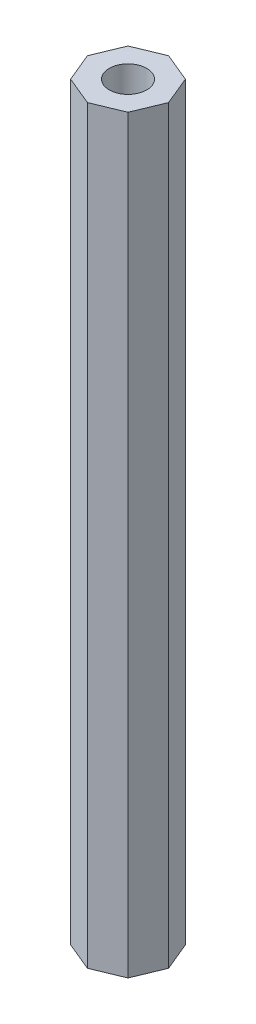
ISO-10303-21;
HEADER;
FILE_DESCRIPTION(('STEP AP214'),'2;1');
FILE_NAME('part.step','',(''),(''),'','','');
FILE_SCHEMA(('AUTOMOTIVE_DESIGN { 1 0 10303 214 1 1 1 1 }'));
ENDSEC;
DATA;
#1=APPLICATION_CONTEXT('core data for automotive mechanical design processes');
#2=APPLICATION_PROTOCOL_DEFINITION('international standard','automotive_design',2000,#1);
#3=PRODUCT_CONTEXT('',#1,'mechanical');
#4=PRODUCT('Part','Part','',(#3));
#5=PRODUCT_RELATED_PRODUCT_CATEGORY('part','',(#4));
#6=PRODUCT_DEFINITION_FORMATION('','',#4);
#7=PRODUCT_DEFINITION_CONTEXT('part definition',#1,'design');
#8=PRODUCT_DEFINITION('design','',#6,#7);
#9=PRODUCT_DEFINITION_SHAPE('','',#8);
#10=(LENGTH_UNIT() NAMED_UNIT(*) SI_UNIT(.MILLI.,.METRE.));
#11=(NAMED_UNIT(*) PLANE_ANGLE_UNIT() SI_UNIT($,.RADIAN.));
#12=(NAMED_UNIT(*) SI_UNIT($,.STERADIAN.) SOLID_ANGLE_UNIT());
#13=UNCERTAINTY_MEASURE_WITH_UNIT(LENGTH_MEASURE(1.E-05),#10,'distance_accuracy_value','');
#14=(GEOMETRIC_REPRESENTATION_CONTEXT(3) GLOBAL_UNCERTAINTY_ASSIGNED_CONTEXT((#13)) GLOBAL_UNIT_ASSIGNED_CONTEXT((#10,
#11,#12)) REPRESENTATION_CONTEXT('',''));
#15=CARTESIAN_POINT('',(0.,0.,0.));
#16=DIRECTION('',(0.,0.,1.));
#17=DIRECTION('',(1.,0.,0.));
#18=AXIS2_PLACEMENT_3D('',#15,#16,#17);
#19=CARTESIAN_POINT('',(0.,30.,0.));
#20=DIRECTION('',(0.,1.,0.));
#21=DIRECTION('',(0.,0.,1.));
#22=AXIS2_PLACEMENT_3D('',#19,#20,#21);
#23=PLANE('',#22);
#24=DIRECTION('',(0.382683432365078,0.,-0.923879532511292));
#25=VECTOR('',#24,1.);
#26=CARTESIAN_POINT('',(1.14805029709528,30.,1.14805029709526));
#27=LINE('',#26,#25);
#28=CARTESIAN_POINT('',(1.14805029709528,30.,1.14805029709526));
#29=VERTEX_POINT('',#28);
#30=CARTESIAN_POINT('',(1.62358830043859,30.,0.));
#31=VERTEX_POINT('',#30);
#32=EDGE_CURVE('E144',#29,#31,#27,.T.);
#33=ORIENTED_EDGE('',*,*,#32,.T.);
#34=DIRECTION('',(-0.382683432365101,0.,-0.923879532511282));
#35=VECTOR('',#34,1.);
#36=CARTESIAN_POINT('',(1.62358830043859,30.,0.));
#37=LINE('',#36,#35);
#38=CARTESIAN_POINT('',(1.14805029709525,30.,-1.14805029709528));
#39=VERTEX_POINT('',#38);
#40=EDGE_CURVE('E92',#31,#39,#37,.T.);
#41=ORIENTED_EDGE('',*,*,#40,.T.);
#42=DIRECTION('',(-0.923879532511292,0.,-0.382683432365078));
#43=VECTOR('',#42,1.);
#44=CARTESIAN_POINT('',(1.14805029709525,30.,-1.14805029709528));
#45=LINE('',#44,#43);
#46=CARTESIAN_POINT('',(0.,30.,-1.62358830043859));
#47=VERTEX_POINT('',#46);
#48=EDGE_CURVE('E159',#39,#47,#45,.T.);
#49=ORIENTED_EDGE('',*,*,#48,.T.);
#50=DIRECTION('',(-0.923879532511282,0.,0.382683432365101));
#51=VECTOR('',#50,1.);
#52=CARTESIAN_POINT('',(0.,30.,-1.62358830043859));
#53=LINE('',#52,#51);
#54=CARTESIAN_POINT('',(-1.14805029709528,30.,-1.14805029709526));
#55=VERTEX_POINT('',#54);
#56=EDGE_CURVE('E172',#47,#55,#53,.T.);
#57=ORIENTED_EDGE('',*,*,#56,.T.);
#58=DIRECTION('',(-0.382683432365078,0.,0.923879532511292));
#59=VECTOR('',#58,1.);
#60=CARTESIAN_POINT('',(-1.14805029709528,30.,-1.14805029709526));
#61=LINE('',#60,#59);
#62=CARTESIAN_POINT('',(-1.62358830043859,30.,0.));
#63=VERTEX_POINT('',#62);
#64=EDGE_CURVE('E111',#55,#63,#61,.T.);
#65=ORIENTED_EDGE('',*,*,#64,.T.);
#66=DIRECTION('',(0.382683432365101,0.,0.923879532511282));
#67=VECTOR('',#66,1.);
#68=CARTESIAN_POINT('',(-1.62358830043859,30.,0.));
#69=LINE('',#68,#67);
#70=CARTESIAN_POINT('',(-1.14805029709526,30.,1.14805029709528));
#71=VERTEX_POINT('',#70);
#72=EDGE_CURVE('E105',#63,#71,#69,.T.);
#73=ORIENTED_EDGE('',*,*,#72,.T.);
#74=DIRECTION('',(0.923879532511292,0.,0.382683432365078));
#75=VECTOR('',#74,1.);
#76=CARTESIAN_POINT('',(-1.14805029709526,30.,1.14805029709528));
#77=LINE('',#76,#75);
#78=CARTESIAN_POINT('',(0.,30.,1.62358830043859));
#79=VERTEX_POINT('',#78);
#80=EDGE_CURVE('E109',#71,#79,#77,.T.);
#81=ORIENTED_EDGE('',*,*,#80,.T.);
#82=DIRECTION('',(0.923879532511282,0.,-0.382683432365101));
#83=VECTOR('',#82,1.);
#84=CARTESIAN_POINT('',(0.,30.,1.62358830043859));
#85=LINE('',#84,#83);
#86=EDGE_CURVE('E49',#79,#29,#85,.T.);
#87=ORIENTED_EDGE('',*,*,#86,.T.);
#88=EDGE_LOOP('',(#33,#41,#49,#57,#65,#73,#81,#87));
#89=FACE_BOUND('',#88,.T.);
#90=CARTESIAN_POINT('',(0.,30.,0.));
#91=DIRECTION('',(0.,1.,0.));
#92=DIRECTION('',(0.,0.,1.));
#93=AXIS2_PLACEMENT_3D('',#90,#91,#92);
#94=CIRCLE('',#93,0.75);
#95=CARTESIAN_POINT('',(0.,30.,0.75));
#96=VERTEX_POINT('',#95);
#97=EDGE_CURVE('E133',#96,#96,#94,.T.);
#98=ORIENTED_EDGE('',*,*,#97,.F.);
#99=EDGE_LOOP('',(#98));
#100=FACE_BOUND('',#99,.T.);
#101=ADVANCED_FACE('F32',(#89,#100),#23,.T.);
#102=CARTESIAN_POINT('',(0.,0.,0.));
#103=DIRECTION('',(0.,1.,0.));
#104=DIRECTION('',(0.,0.,1.));
#105=AXIS2_PLACEMENT_3D('',#102,#103,#104);
#106=PLANE('',#105);
#107=DIRECTION('',(0.382683432365078,0.,-0.923879532511292));
#108=VECTOR('',#107,1.);
#109=CARTESIAN_POINT('',(1.14805029709528,0.,1.14805029709526));
#110=LINE('',#109,#108);
#111=CARTESIAN_POINT('',(1.14805029709528,0.,1.14805029709526));
#112=VERTEX_POINT('',#111);
#113=CARTESIAN_POINT('',(1.62358830043859,0.,0.));
#114=VERTEX_POINT('',#113);
#115=EDGE_CURVE('E129',#112,#114,#110,.T.);
#116=ORIENTED_EDGE('',*,*,#115,.F.);
#117=DIRECTION('',(0.923879532511282,0.,-0.382683432365101));
#118=VECTOR('',#117,1.);
#119=CARTESIAN_POINT('',(0.,0.,1.62358830043859));
#120=LINE('',#119,#118);
#121=CARTESIAN_POINT('',(0.,0.,1.62358830043859));
#122=VERTEX_POINT('',#121);
#123=EDGE_CURVE('E84',#122,#112,#120,.T.);
#124=ORIENTED_EDGE('',*,*,#123,.F.);
#125=DIRECTION('',(0.923879532511292,0.,0.382683432365078));
#126=VECTOR('',#125,1.);
#127=CARTESIAN_POINT('',(-1.14805029709526,0.,1.14805029709528));
#128=LINE('',#127,#126);
#129=CARTESIAN_POINT('',(-1.14805029709526,0.,1.14805029709528));
#130=VERTEX_POINT('',#129);
#131=EDGE_CURVE('E78',#130,#122,#128,.T.);
#132=ORIENTED_EDGE('',*,*,#131,.F.);
#133=DIRECTION('',(0.382683432365101,0.,0.923879532511282));
#134=VECTOR('',#133,1.);
#135=CARTESIAN_POINT('',(-1.62358830043859,0.,0.));
#136=LINE('',#135,#134);
#137=CARTESIAN_POINT('',(-1.62358830043859,0.,0.));
#138=VERTEX_POINT('',#137);
#139=EDGE_CURVE('E119',#138,#130,#136,.T.);
#140=ORIENTED_EDGE('',*,*,#139,.F.);
#141=DIRECTION('',(-0.382683432365078,0.,0.923879532511292));
#142=VECTOR('',#141,1.);
#143=CARTESIAN_POINT('',(-1.14805029709528,0.,-1.14805029709526));
#144=LINE('',#143,#142);
#145=CARTESIAN_POINT('',(-1.14805029709528,0.,-1.14805029709526));
#146=VERTEX_POINT('',#145);
#147=EDGE_CURVE('E139',#146,#138,#144,.T.);
#148=ORIENTED_EDGE('',*,*,#147,.F.);
#149=DIRECTION('',(-0.923879532511282,0.,0.382683432365101));
#150=VECTOR('',#149,1.);
#151=CARTESIAN_POINT('',(0.,0.,-1.62358830043859));
#152=LINE('',#151,#150);
#153=CARTESIAN_POINT('',(0.,0.,-1.62358830043859));
#154=VERTEX_POINT('',#153);
#155=EDGE_CURVE('E137',#154,#146,#152,.T.);
#156=ORIENTED_EDGE('',*,*,#155,.F.);
#157=DIRECTION('',(-0.923879532511292,0.,-0.382683432365078));
#158=VECTOR('',#157,1.);
#159=CARTESIAN_POINT('',(1.14805029709525,0.,-1.14805029709528));
#160=LINE('',#159,#158);
#161=CARTESIAN_POINT('',(1.14805029709525,0.,-1.14805029709528));
#162=VERTEX_POINT('',#161);
#163=EDGE_CURVE('E135',#162,#154,#160,.T.);
#164=ORIENTED_EDGE('',*,*,#163,.F.);
#165=DIRECTION('',(-0.382683432365101,0.,-0.923879532511282));
#166=VECTOR('',#165,1.);
#167=CARTESIAN_POINT('',(1.62358830043859,0.,0.));
#168=LINE('',#167,#166);
#169=EDGE_CURVE('E132',#114,#162,#168,.T.);
#170=ORIENTED_EDGE('',*,*,#169,.F.);
#171=EDGE_LOOP('',(#116,#124,#132,#140,#148,#156,#164,#170));
#172=FACE_BOUND('',#171,.T.);
#173=CARTESIAN_POINT('',(0.,0.,0.));
#174=DIRECTION('',(0.,1.,0.));
#175=DIRECTION('',(0.,0.,1.));
#176=AXIS2_PLACEMENT_3D('',#173,#174,#175);
#177=CIRCLE('',#176,0.75);
#178=CARTESIAN_POINT('',(0.,0.,0.75));
#179=VERTEX_POINT('',#178);
#180=EDGE_CURVE('E178',#179,#179,#177,.T.);
#181=ORIENTED_EDGE('',*,*,#180,.T.);
#182=EDGE_LOOP('',(#181));
#183=FACE_BOUND('',#182,.T.);
#184=ADVANCED_FACE('F163',(#172,#183),#106,.F.);
#185=CARTESIAN_POINT('',(1.14805029709528,30.,1.14805029709526));
#186=DIRECTION('',(-0.923879532511292,0.,-0.382683432365078));
#187=DIRECTION('',(-0.382683432365078,0.,0.923879532511292));
#188=AXIS2_PLACEMENT_3D('',#185,#186,#187);
#189=PLANE('',#188);
#190=ORIENTED_EDGE('',*,*,#115,.T.);
#191=DIRECTION('',(0.,-1.,0.));
#192=VECTOR('',#191,1.);
#193=CARTESIAN_POINT('',(1.62358830043859,30.,0.));
#194=LINE('',#193,#192);
#195=EDGE_CURVE('E11',#31,#114,#194,.T.);
#196=ORIENTED_EDGE('',*,*,#195,.F.);
#197=ORIENTED_EDGE('',*,*,#32,.F.);
#198=DIRECTION('',(0.,-1.,0.));
#199=VECTOR('',#198,1.);
#200=CARTESIAN_POINT('',(1.14805029709528,30.,1.14805029709526));
#201=LINE('',#200,#199);
#202=EDGE_CURVE('E125',#29,#112,#201,.T.);
#203=ORIENTED_EDGE('',*,*,#202,.T.);
#204=EDGE_LOOP('',(#190,#196,#197,#203));
#205=FACE_BOUND('',#204,.T.);
#206=ADVANCED_FACE('F34',(#205),#189,.F.);
#207=CARTESIAN_POINT('',(1.62358830043859,30.,0.));
#208=DIRECTION('',(-0.923879532511282,0.,0.382683432365101));
#209=DIRECTION('',(0.382683432365101,0.,0.923879532511282));
#210=AXIS2_PLACEMENT_3D('',#207,#208,#209);
#211=PLANE('',#210);
#212=ORIENTED_EDGE('',*,*,#169,.T.);
#213=DIRECTION('',(0.,-1.,0.));
#214=VECTOR('',#213,1.);
#215=CARTESIAN_POINT('',(1.14805029709525,30.,-1.14805029709528));
#216=LINE('',#215,#214);
#217=EDGE_CURVE('E41',#39,#162,#216,.T.);
#218=ORIENTED_EDGE('',*,*,#217,.F.);
#219=ORIENTED_EDGE('',*,*,#40,.F.);
#220=ORIENTED_EDGE('',*,*,#195,.T.);
#221=EDGE_LOOP('',(#212,#218,#219,#220));
#222=FACE_BOUND('',#221,.T.);
#223=ADVANCED_FACE('F206',(#222),#211,.F.);
#224=CARTESIAN_POINT('',(1.14805029709525,30.,-1.14805029709528));
#225=DIRECTION('',(-0.382683432365078,0.,0.923879532511292));
#226=DIRECTION('',(0.923879532511292,0.,0.382683432365078));
#227=AXIS2_PLACEMENT_3D('',#224,#225,#226);
#228=PLANE('',#227);
#229=ORIENTED_EDGE('',*,*,#163,.T.);
#230=DIRECTION('',(0.,-1.,0.));
#231=VECTOR('',#230,1.);
#232=CARTESIAN_POINT('',(0.,30.,-1.62358830043859));
#233=LINE('',#232,#231);
#234=EDGE_CURVE('E151',#47,#154,#233,.T.);
#235=ORIENTED_EDGE('',*,*,#234,.F.);
#236=ORIENTED_EDGE('',*,*,#48,.F.);
#237=ORIENTED_EDGE('',*,*,#217,.T.);
#238=EDGE_LOOP('',(#229,#235,#236,#237));
#239=FACE_BOUND('',#238,.T.);
#240=ADVANCED_FACE('F157',(#239),#228,.F.);
#241=CARTESIAN_POINT('',(0.,30.,-1.62358830043859));
#242=DIRECTION('',(0.382683432365101,0.,0.923879532511282));
#243=DIRECTION('',(0.923879532511282,0.,-0.382683432365101));
#244=AXIS2_PLACEMENT_3D('',#241,#242,#243);
#245=PLANE('',#244);
#246=ORIENTED_EDGE('',*,*,#155,.T.);
#247=DIRECTION('',(0.,-1.,0.));
#248=VECTOR('',#247,1.);
#249=CARTESIAN_POINT('',(-1.14805029709528,30.,-1.14805029709526));
#250=LINE('',#249,#248);
#251=EDGE_CURVE('E148',#55,#146,#250,.T.);
#252=ORIENTED_EDGE('',*,*,#251,.F.);
#253=ORIENTED_EDGE('',*,*,#56,.F.);
#254=ORIENTED_EDGE('',*,*,#234,.T.);
#255=EDGE_LOOP('',(#246,#252,#253,#254));
#256=FACE_BOUND('',#255,.T.);
#257=ADVANCED_FACE('F168',(#256),#245,.F.);
#258=CARTESIAN_POINT('',(-1.14805029709528,30.,-1.14805029709526));
#259=DIRECTION('',(0.923879532511292,0.,0.382683432365078));
#260=DIRECTION('',(0.382683432365078,0.,-0.923879532511292));
#261=AXIS2_PLACEMENT_3D('',#258,#259,#260);
#262=PLANE('',#261);
#263=ORIENTED_EDGE('',*,*,#147,.T.);
#264=DIRECTION('',(0.,-1.,0.));
#265=VECTOR('',#264,1.);
#266=CARTESIAN_POINT('',(-1.62358830043859,30.,0.));
#267=LINE('',#266,#265);
#268=EDGE_CURVE('E120',#63,#138,#267,.T.);
#269=ORIENTED_EDGE('',*,*,#268,.F.);
#270=ORIENTED_EDGE('',*,*,#64,.F.);
#271=ORIENTED_EDGE('',*,*,#251,.T.);
#272=EDGE_LOOP('',(#263,#269,#270,#271));
#273=FACE_BOUND('',#272,.T.);
#274=ADVANCED_FACE('F171',(#273),#262,.F.);
#275=CARTESIAN_POINT('',(-1.62358830043859,30.,0.));
#276=DIRECTION('',(0.923879532511282,0.,-0.382683432365101));
#277=DIRECTION('',(-0.382683432365101,0.,-0.923879532511282));
#278=AXIS2_PLACEMENT_3D('',#275,#276,#277);
#279=PLANE('',#278);
#280=ORIENTED_EDGE('',*,*,#139,.T.);
#281=DIRECTION('',(0.,-1.,0.));
#282=VECTOR('',#281,1.);
#283=CARTESIAN_POINT('',(-1.14805029709526,30.,1.14805029709528));
#284=LINE('',#283,#282);
#285=EDGE_CURVE('E116',#71,#130,#284,.T.);
#286=ORIENTED_EDGE('',*,*,#285,.F.);
#287=ORIENTED_EDGE('',*,*,#72,.F.);
#288=ORIENTED_EDGE('',*,*,#268,.T.);
#289=EDGE_LOOP('',(#280,#286,#287,#288));
#290=FACE_BOUND('',#289,.T.);
#291=ADVANCED_FACE('F117',(#290),#279,.F.);
#292=CARTESIAN_POINT('',(-1.14805029709526,30.,1.14805029709528));
#293=DIRECTION('',(0.382683432365078,0.,-0.923879532511292));
#294=DIRECTION('',(-0.923879532511292,0.,-0.382683432365078));
#295=AXIS2_PLACEMENT_3D('',#292,#293,#294);
#296=PLANE('',#295);
#297=ORIENTED_EDGE('',*,*,#131,.T.);
#298=DIRECTION('',(0.,-1.,0.));
#299=VECTOR('',#298,1.);
#300=CARTESIAN_POINT('',(0.,30.,1.62358830043859));
#301=LINE('',#300,#299);
#302=EDGE_CURVE('E121',#79,#122,#301,.T.);
#303=ORIENTED_EDGE('',*,*,#302,.F.);
#304=ORIENTED_EDGE('',*,*,#80,.F.);
#305=ORIENTED_EDGE('',*,*,#285,.T.);
#306=EDGE_LOOP('',(#297,#303,#304,#305));
#307=FACE_BOUND('',#306,.T.);
#308=ADVANCED_FACE('F123',(#307),#296,.F.);
#309=CARTESIAN_POINT('',(0.,30.,1.62358830043859));
#310=DIRECTION('',(-0.382683432365101,0.,-0.923879532511282));
#311=DIRECTION('',(-0.923879532511282,0.,0.382683432365101));
#312=AXIS2_PLACEMENT_3D('',#309,#310,#311);
#313=PLANE('',#312);
#314=ORIENTED_EDGE('',*,*,#123,.T.);
#315=ORIENTED_EDGE('',*,*,#202,.F.);
#316=ORIENTED_EDGE('',*,*,#86,.F.);
#317=ORIENTED_EDGE('',*,*,#302,.T.);
#318=EDGE_LOOP('',(#314,#315,#316,#317));
#319=FACE_BOUND('',#318,.T.);
#320=ADVANCED_FACE('F194',(#319),#313,.F.);
#321=CARTESIAN_POINT('',(0.,30.,0.));
#322=DIRECTION('',(0.,-1.,0.));
#323=DIRECTION('',(0.,0.,-1.));
#324=AXIS2_PLACEMENT_3D('',#321,#322,#323);
#325=CYLINDRICAL_SURFACE('',#324,0.75);
#326=ORIENTED_EDGE('',*,*,#97,.T.);
#327=EDGE_LOOP('',(#326));
#328=FACE_BOUND('',#327,.T.);
#329=ORIENTED_EDGE('',*,*,#180,.F.);
#330=EDGE_LOOP('',(#329));
#331=FACE_BOUND('',#330,.T.);
#332=ADVANCED_FACE('F184',(#328,#331),#325,.F.);
#333=CLOSED_SHELL('',(#101,#184,#206,#223,#240,#257,#274,#291,#308,#320,#332));
#334=MANIFOLD_SOLID_BREP('B2',#333);
#335=ADVANCED_BREP_SHAPE_REPRESENTATION('',(#18,#334),#14);
#336=SHAPE_DEFINITION_REPRESENTATION(#9,#335);
ENDSEC;
END-ISO-10303-21;
